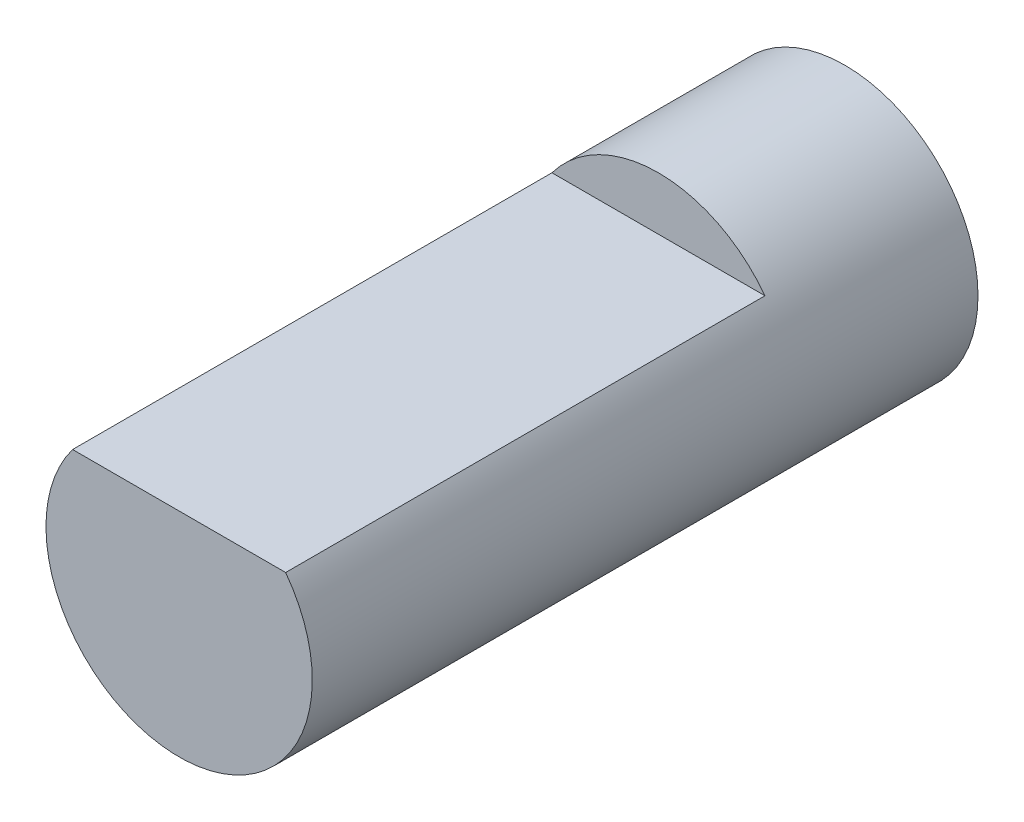
ISO-10303-21;
HEADER;
FILE_DESCRIPTION(('STEP AP214'),'2;1');
FILE_NAME('part.step','',(''),(''),'','','');
FILE_SCHEMA(('AUTOMOTIVE_DESIGN { 1 0 10303 214 1 1 1 1 }'));
ENDSEC;
DATA;
#1=APPLICATION_CONTEXT('core data for automotive mechanical design processes');
#2=APPLICATION_PROTOCOL_DEFINITION('international standard','automotive_design',2000,#1);
#3=PRODUCT_CONTEXT('',#1,'mechanical');
#4=PRODUCT('Part','Part','',(#3));
#5=PRODUCT_RELATED_PRODUCT_CATEGORY('part','',(#4));
#6=PRODUCT_DEFINITION_FORMATION('','',#4);
#7=PRODUCT_DEFINITION_CONTEXT('part definition',#1,'design');
#8=PRODUCT_DEFINITION('design','',#6,#7);
#9=PRODUCT_DEFINITION_SHAPE('','',#8);
#10=(LENGTH_UNIT() NAMED_UNIT(*) SI_UNIT(.MILLI.,.METRE.));
#11=(NAMED_UNIT(*) PLANE_ANGLE_UNIT() SI_UNIT($,.RADIAN.));
#12=(NAMED_UNIT(*) SI_UNIT($,.STERADIAN.) SOLID_ANGLE_UNIT());
#13=UNCERTAINTY_MEASURE_WITH_UNIT(LENGTH_MEASURE(1.E-05),#10,'distance_accuracy_value','');
#14=(GEOMETRIC_REPRESENTATION_CONTEXT(3) GLOBAL_UNCERTAINTY_ASSIGNED_CONTEXT((#13)) GLOBAL_UNIT_ASSIGNED_CONTEXT((#10,
#11,#12)) REPRESENTATION_CONTEXT('',''));
#15=CARTESIAN_POINT('',(0.,0.,0.));
#16=DIRECTION('',(0.,0.,1.));
#17=DIRECTION('',(1.,0.,0.));
#18=AXIS2_PLACEMENT_3D('',#15,#16,#17);
#19=CARTESIAN_POINT('',(0.,0.,3.5));
#20=DIRECTION('',(0.,0.,-1.));
#21=DIRECTION('',(-1.,0.,0.));
#22=AXIS2_PLACEMENT_3D('',#19,#20,#21);
#23=CYLINDRICAL_SURFACE('',#22,2.5);
#24=CARTESIAN_POINT('',(0.,0.,3.5));
#25=DIRECTION('',(0.,0.,1.));
#26=DIRECTION('',(1.,0.,0.));
#27=AXIS2_PLACEMENT_3D('',#24,#25,#26);
#28=CIRCLE('',#27,2.5);
#29=CARTESIAN_POINT('',(2.,1.5,3.5));
#30=VERTEX_POINT('',#29);
#31=CARTESIAN_POINT('',(-2.,1.5,3.5));
#32=VERTEX_POINT('',#31);
#33=EDGE_CURVE('E11',#30,#32,#28,.T.);
#34=ORIENTED_EDGE('',*,*,#33,.F.);
#35=DIRECTION('',(0.,0.,-1.));
#36=VECTOR('',#35,1.);
#37=CARTESIAN_POINT('',(2.,1.5,12.5));
#38=LINE('',#37,#36);
#39=CARTESIAN_POINT('',(2.,1.5,12.5));
#40=VERTEX_POINT('',#39);
#41=EDGE_CURVE('E67',#40,#30,#38,.T.);
#42=ORIENTED_EDGE('',*,*,#41,.F.);
#43=CARTESIAN_POINT('',(0.,0.,12.5));
#44=DIRECTION('',(0.,0.,1.));
#45=DIRECTION('',(1.,0.,0.));
#46=AXIS2_PLACEMENT_3D('',#43,#44,#45);
#47=CIRCLE('',#46,2.5);
#48=CARTESIAN_POINT('',(-2.,1.5,12.5));
#49=VERTEX_POINT('',#48);
#50=EDGE_CURVE('E68',#49,#40,#47,.T.);
#51=ORIENTED_EDGE('',*,*,#50,.F.);
#52=DIRECTION('',(0.,0.,-1.));
#53=VECTOR('',#52,1.);
#54=CARTESIAN_POINT('',(-2.,1.5,12.5));
#55=LINE('',#54,#53);
#56=EDGE_CURVE('E65',#49,#32,#55,.T.);
#57=ORIENTED_EDGE('',*,*,#56,.T.);
#58=EDGE_LOOP('',(#34,#42,#51,#57));
#59=FACE_BOUND('',#58,.T.);
#60=CARTESIAN_POINT('',(0.,0.,0.));
#61=DIRECTION('',(0.,0.,1.));
#62=DIRECTION('',(1.,0.,0.));
#63=AXIS2_PLACEMENT_3D('',#60,#61,#62);
#64=CIRCLE('',#63,2.5);
#65=CARTESIAN_POINT('',(2.5,0.,0.));
#66=VERTEX_POINT('',#65);
#67=EDGE_CURVE('E37',#66,#66,#64,.T.);
#68=ORIENTED_EDGE('',*,*,#67,.T.);
#69=EDGE_LOOP('',(#68));
#70=FACE_BOUND('',#69,.T.);
#71=ADVANCED_FACE('F34',(#59,#70),#23,.T.);
#72=CARTESIAN_POINT('',(0.,0.,3.5));
#73=DIRECTION('',(0.,0.,1.));
#74=DIRECTION('',(1.,0.,0.));
#75=AXIS2_PLACEMENT_3D('',#72,#73,#74);
#76=PLANE('',#75);
#77=DIRECTION('',(-1.,0.,0.));
#78=VECTOR('',#77,1.);
#79=CARTESIAN_POINT('',(-2.,1.5,3.5));
#80=LINE('',#79,#78);
#81=EDGE_CURVE('E46',#30,#32,#80,.T.);
#82=ORIENTED_EDGE('',*,*,#81,.F.);
#83=ORIENTED_EDGE('',*,*,#33,.T.);
#84=EDGE_LOOP('',(#82,#83));
#85=FACE_BOUND('',#84,.T.);
#86=ADVANCED_FACE('F58',(#85),#76,.T.);
#87=CARTESIAN_POINT('',(0.,0.,0.));
#88=DIRECTION('',(0.,0.,1.));
#89=DIRECTION('',(1.,0.,0.));
#90=AXIS2_PLACEMENT_3D('',#87,#88,#89);
#91=PLANE('',#90);
#92=ORIENTED_EDGE('',*,*,#67,.F.);
#93=EDGE_LOOP('',(#92));
#94=FACE_BOUND('',#93,.T.);
#95=ADVANCED_FACE('F81',(#94),#91,.F.);
#96=CARTESIAN_POINT('',(-2.,1.5,12.5));
#97=DIRECTION('',(0.,-1.,0.));
#98=DIRECTION('',(0.,0.,-1.));
#99=AXIS2_PLACEMENT_3D('',#96,#97,#98);
#100=PLANE('',#99);
#101=ORIENTED_EDGE('',*,*,#81,.T.);
#102=ORIENTED_EDGE('',*,*,#56,.F.);
#103=DIRECTION('',(-1.,0.,0.));
#104=VECTOR('',#103,1.);
#105=CARTESIAN_POINT('',(-2.,1.5,12.5));
#106=LINE('',#105,#104);
#107=EDGE_CURVE('E54',#40,#49,#106,.T.);
#108=ORIENTED_EDGE('',*,*,#107,.F.);
#109=ORIENTED_EDGE('',*,*,#41,.T.);
#110=EDGE_LOOP('',(#101,#102,#108,#109));
#111=FACE_BOUND('',#110,.T.);
#112=ADVANCED_FACE('F64',(#111),#100,.F.);
#113=CARTESIAN_POINT('',(0.,0.,12.5));
#114=DIRECTION('',(0.,0.,1.));
#115=DIRECTION('',(1.,0.,0.));
#116=AXIS2_PLACEMENT_3D('',#113,#114,#115);
#117=PLANE('',#116);
#118=ORIENTED_EDGE('',*,*,#50,.T.);
#119=ORIENTED_EDGE('',*,*,#107,.T.);
#120=EDGE_LOOP('',(#118,#119));
#121=FACE_BOUND('',#120,.T.);
#122=ADVANCED_FACE('F75',(#121),#117,.T.);
#123=CLOSED_SHELL('',(#71,#86,#95,#112,#122));
#124=MANIFOLD_SOLID_BREP('B2',#123);
#125=ADVANCED_BREP_SHAPE_REPRESENTATION('',(#18,#124),#14);
#126=SHAPE_DEFINITION_REPRESENTATION(#9,#125);
ENDSEC;
END-ISO-10303-21;
